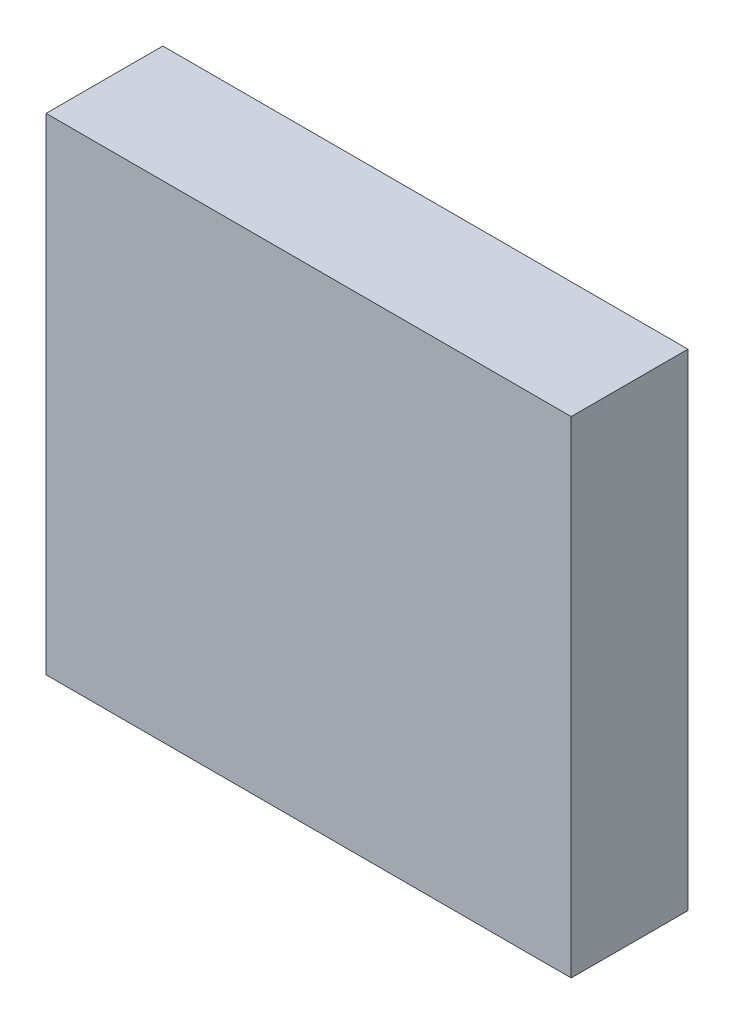
ISO-10303-21;
HEADER;
FILE_DESCRIPTION(('STEP AP214'),'2;1');
FILE_NAME('part.step','',(''),(''),'','','');
FILE_SCHEMA(('AUTOMOTIVE_DESIGN { 1 0 10303 214 1 1 1 1 }'));
ENDSEC;
DATA;
#1=APPLICATION_CONTEXT('core data for automotive mechanical design processes');
#2=APPLICATION_PROTOCOL_DEFINITION('international standard','automotive_design',2000,#1);
#3=PRODUCT_CONTEXT('',#1,'mechanical');
#4=PRODUCT('Part','Part','',(#3));
#5=PRODUCT_RELATED_PRODUCT_CATEGORY('part','',(#4));
#6=PRODUCT_DEFINITION_FORMATION('','',#4);
#7=PRODUCT_DEFINITION_CONTEXT('part definition',#1,'design');
#8=PRODUCT_DEFINITION('design','',#6,#7);
#9=PRODUCT_DEFINITION_SHAPE('','',#8);
#10=(LENGTH_UNIT() NAMED_UNIT(*) SI_UNIT(.MILLI.,.METRE.));
#11=(NAMED_UNIT(*) PLANE_ANGLE_UNIT() SI_UNIT($,.RADIAN.));
#12=(NAMED_UNIT(*) SI_UNIT($,.STERADIAN.) SOLID_ANGLE_UNIT());
#13=UNCERTAINTY_MEASURE_WITH_UNIT(LENGTH_MEASURE(1.E-05),#10,'distance_accuracy_value','');
#14=(GEOMETRIC_REPRESENTATION_CONTEXT(3) GLOBAL_UNCERTAINTY_ASSIGNED_CONTEXT((#13)) GLOBAL_UNIT_ASSIGNED_CONTEXT((#10,
#11,#12)) REPRESENTATION_CONTEXT('',''));
#15=CARTESIAN_POINT('',(0.,0.,0.));
#16=DIRECTION('',(0.,0.,1.));
#17=DIRECTION('',(1.,0.,0.));
#18=AXIS2_PLACEMENT_3D('',#15,#16,#17);
#19=CARTESIAN_POINT('',(5.4,5.,2.4));
#20=DIRECTION('',(-1.,0.,0.));
#21=DIRECTION('',(0.,-1.,0.));
#22=AXIS2_PLACEMENT_3D('',#19,#20,#21);
#23=PLANE('',#22);
#24=DIRECTION('',(0.,1.,0.));
#25=VECTOR('',#24,1.);
#26=CARTESIAN_POINT('',(5.4,5.,0.));
#27=LINE('',#26,#25);
#28=CARTESIAN_POINT('',(5.4,-5.,0.));
#29=VERTEX_POINT('',#28);
#30=CARTESIAN_POINT('',(5.4,5.,0.));
#31=VERTEX_POINT('',#30);
#32=EDGE_CURVE('E294',#29,#31,#27,.T.);
#33=ORIENTED_EDGE('',*,*,#32,.T.);
#34=DIRECTION('',(0.,0.,-1.));
#35=VECTOR('',#34,1.);
#36=CARTESIAN_POINT('',(5.4,5.,2.4));
#37=LINE('',#36,#35);
#38=CARTESIAN_POINT('',(5.4,5.,2.4));
#39=VERTEX_POINT('',#38);
#40=EDGE_CURVE('E11',#39,#31,#37,.T.);
#41=ORIENTED_EDGE('',*,*,#40,.F.);
#42=DIRECTION('',(0.,1.,0.));
#43=VECTOR('',#42,1.);
#44=CARTESIAN_POINT('',(5.4,5.,2.4));
#45=LINE('',#44,#43);
#46=CARTESIAN_POINT('',(5.4,-5.,2.4));
#47=VERTEX_POINT('',#46);
#48=EDGE_CURVE('E301',#47,#39,#45,.T.);
#49=ORIENTED_EDGE('',*,*,#48,.F.);
#50=DIRECTION('',(0.,0.,-1.));
#51=VECTOR('',#50,1.);
#52=CARTESIAN_POINT('',(5.4,-5.,2.4));
#53=LINE('',#52,#51);
#54=EDGE_CURVE('E311',#47,#29,#53,.T.);
#55=ORIENTED_EDGE('',*,*,#54,.T.);
#56=EDGE_LOOP('',(#33,#41,#49,#55));
#57=FACE_BOUND('',#56,.T.);
#58=ADVANCED_FACE('F32',(#57),#23,.F.);
#59=CARTESIAN_POINT('',(-5.4,5.,2.4));
#60=DIRECTION('',(0.,-1.,0.));
#61=DIRECTION('',(0.,0.,-1.));
#62=AXIS2_PLACEMENT_3D('',#59,#60,#61);
#63=PLANE('',#62);
#64=DIRECTION('',(-1.,0.,0.));
#65=VECTOR('',#64,1.);
#66=CARTESIAN_POINT('',(-5.4,5.,0.));
#67=LINE('',#66,#65);
#68=CARTESIAN_POINT('',(-5.4,5.,0.));
#69=VERTEX_POINT('',#68);
#70=EDGE_CURVE('E314',#31,#69,#67,.T.);
#71=ORIENTED_EDGE('',*,*,#70,.T.);
#72=DIRECTION('',(0.,0.,-1.));
#73=VECTOR('',#72,1.);
#74=CARTESIAN_POINT('',(-5.4,5.,2.4));
#75=LINE('',#74,#73);
#76=CARTESIAN_POINT('',(-5.4,5.,2.4));
#77=VERTEX_POINT('',#76);
#78=EDGE_CURVE('E39',#77,#69,#75,.T.);
#79=ORIENTED_EDGE('',*,*,#78,.F.);
#80=DIRECTION('',(-1.,0.,0.));
#81=VECTOR('',#80,1.);
#82=CARTESIAN_POINT('',(-5.4,5.,2.4));
#83=LINE('',#82,#81);
#84=EDGE_CURVE('E304',#39,#77,#83,.T.);
#85=ORIENTED_EDGE('',*,*,#84,.F.);
#86=ORIENTED_EDGE('',*,*,#40,.T.);
#87=EDGE_LOOP('',(#71,#79,#85,#86));
#88=FACE_BOUND('',#87,.T.);
#89=ADVANCED_FACE('F344',(#88),#63,.F.);
#90=CARTESIAN_POINT('',(-5.4,5.,2.4));
#91=DIRECTION('',(1.,0.,0.));
#92=DIRECTION('',(0.,1.,0.));
#93=AXIS2_PLACEMENT_3D('',#90,#91,#92);
#94=PLANE('',#93);
#95=DIRECTION('',(0.,-1.,0.));
#96=VECTOR('',#95,1.);
#97=CARTESIAN_POINT('',(-5.4,5.,0.));
#98=LINE('',#97,#96);
#99=CARTESIAN_POINT('',(-5.4,-5.,0.));
#100=VERTEX_POINT('',#99);
#101=EDGE_CURVE('E316',#69,#100,#98,.T.);
#102=ORIENTED_EDGE('',*,*,#101,.T.);
#103=DIRECTION('',(0.,0.,-1.));
#104=VECTOR('',#103,1.);
#105=CARTESIAN_POINT('',(-5.4,-5.,2.4));
#106=LINE('',#105,#104);
#107=CARTESIAN_POINT('',(-5.4,-5.,2.4));
#108=VERTEX_POINT('',#107);
#109=EDGE_CURVE('E321',#108,#100,#106,.T.);
#110=ORIENTED_EDGE('',*,*,#109,.F.);
#111=DIRECTION('',(0.,-1.,0.));
#112=VECTOR('',#111,1.);
#113=CARTESIAN_POINT('',(-5.4,5.,2.4));
#114=LINE('',#113,#112);
#115=EDGE_CURVE('E307',#77,#108,#114,.T.);
#116=ORIENTED_EDGE('',*,*,#115,.F.);
#117=ORIENTED_EDGE('',*,*,#78,.T.);
#118=EDGE_LOOP('',(#102,#110,#116,#117));
#119=FACE_BOUND('',#118,.T.);
#120=ADVANCED_FACE('F328',(#119),#94,.F.);
#121=CARTESIAN_POINT('',(-5.4,-5.,2.4));
#122=DIRECTION('',(0.,1.,0.));
#123=DIRECTION('',(0.,0.,1.));
#124=AXIS2_PLACEMENT_3D('',#121,#122,#123);
#125=PLANE('',#124);
#126=DIRECTION('',(-1.,0.,0.));
#127=VECTOR('',#126,1.);
#128=CARTESIAN_POINT('',(-4.41,-5.,1.8));
#129=LINE('',#128,#127);
#130=CARTESIAN_POINT('',(-3.21,-5.,1.8));
#131=VERTEX_POINT('',#130);
#132=CARTESIAN_POINT('',(-4.41,-5.,1.8));
#133=VERTEX_POINT('',#132);
#134=EDGE_CURVE('E197',#131,#133,#129,.T.);
#135=ORIENTED_EDGE('',*,*,#134,.F.);
#136=DIRECTION('',(0.,0.,1.));
#137=VECTOR('',#136,1.);
#138=CARTESIAN_POINT('',(-3.21,-5.,1.8));
#139=LINE('',#138,#137);
#140=CARTESIAN_POINT('',(-3.21,-5.,0.6));
#141=VERTEX_POINT('',#140);
#142=EDGE_CURVE('E46',#141,#131,#139,.T.);
#143=ORIENTED_EDGE('',*,*,#142,.F.);
#144=DIRECTION('',(1.,0.,0.));
#145=VECTOR('',#144,1.);
#146=CARTESIAN_POINT('',(-4.41,-5.,0.6));
#147=LINE('',#146,#145);
#148=CARTESIAN_POINT('',(-4.41,-5.,0.6));
#149=VERTEX_POINT('',#148);
#150=EDGE_CURVE('E188',#149,#141,#147,.T.);
#151=ORIENTED_EDGE('',*,*,#150,.F.);
#152=DIRECTION('',(0.,0.,-1.));
#153=VECTOR('',#152,1.);
#154=CARTESIAN_POINT('',(-4.41,-5.,1.8));
#155=LINE('',#154,#153);
#156=EDGE_CURVE('E191',#133,#149,#155,.T.);
#157=ORIENTED_EDGE('',*,*,#156,.F.);
#158=EDGE_LOOP('',(#135,#143,#151,#157));
#159=FACE_BOUND('',#158,.T.);
#160=DIRECTION('',(0.,0.,-1.));
#161=VECTOR('',#160,1.);
#162=CARTESIAN_POINT('',(0.670000000000001,-5.,1.8));
#163=LINE('',#162,#161);
#164=CARTESIAN_POINT('',(0.670000000000001,-5.,1.8));
#165=VERTEX_POINT('',#164);
#166=CARTESIAN_POINT('',(0.670000000000001,-5.,0.6));
#167=VERTEX_POINT('',#166);
#168=EDGE_CURVE('E223',#165,#167,#163,.T.);
#169=ORIENTED_EDGE('',*,*,#168,.F.);
#170=DIRECTION('',(-1.,0.,0.));
#171=VECTOR('',#170,1.);
#172=CARTESIAN_POINT('',(1.87,-5.,1.8));
#173=LINE('',#172,#171);
#174=CARTESIAN_POINT('',(1.87,-5.,1.8));
#175=VERTEX_POINT('',#174);
#176=EDGE_CURVE('E54',#175,#165,#173,.T.);
#177=ORIENTED_EDGE('',*,*,#176,.F.);
#178=DIRECTION('',(0.,0.,1.));
#179=VECTOR('',#178,1.);
#180=CARTESIAN_POINT('',(1.87,-5.,1.8));
#181=LINE('',#180,#179);
#182=CARTESIAN_POINT('',(1.87,-5.,0.6));
#183=VERTEX_POINT('',#182);
#184=EDGE_CURVE('E212',#183,#175,#181,.T.);
#185=ORIENTED_EDGE('',*,*,#184,.F.);
#186=DIRECTION('',(1.,0.,0.));
#187=VECTOR('',#186,1.);
#188=CARTESIAN_POINT('',(1.87,-5.,0.6));
#189=LINE('',#188,#187);
#190=EDGE_CURVE('E227',#167,#183,#189,.T.);
#191=ORIENTED_EDGE('',*,*,#190,.F.);
#192=EDGE_LOOP('',(#169,#177,#185,#191));
#193=FACE_BOUND('',#192,.T.);
#194=DIRECTION('',(0.,0.,-1.));
#195=VECTOR('',#194,1.);
#196=CARTESIAN_POINT('',(3.21,-5.,1.8));
#197=LINE('',#196,#195);
#198=CARTESIAN_POINT('',(3.21,-5.,1.8));
#199=VERTEX_POINT('',#198);
#200=CARTESIAN_POINT('',(3.21,-5.,0.6));
#201=VERTEX_POINT('',#200);
#202=EDGE_CURVE('E254',#199,#201,#197,.T.);
#203=ORIENTED_EDGE('',*,*,#202,.F.);
#204=DIRECTION('',(-1.,0.,0.));
#205=VECTOR('',#204,1.);
#206=CARTESIAN_POINT('',(4.41,-5.,1.8));
#207=LINE('',#206,#205);
#208=CARTESIAN_POINT('',(4.41,-5.,1.8));
#209=VERTEX_POINT('',#208);
#210=EDGE_CURVE('E252',#209,#199,#207,.T.);
#211=ORIENTED_EDGE('',*,*,#210,.F.);
#212=DIRECTION('',(0.,0.,1.));
#213=VECTOR('',#212,1.);
#214=CARTESIAN_POINT('',(4.41,-5.,1.8));
#215=LINE('',#214,#213);
#216=CARTESIAN_POINT('',(4.41,-5.,0.6));
#217=VERTEX_POINT('',#216);
#218=EDGE_CURVE('E242',#217,#209,#215,.T.);
#219=ORIENTED_EDGE('',*,*,#218,.F.);
#220=DIRECTION('',(1.,0.,0.));
#221=VECTOR('',#220,1.);
#222=CARTESIAN_POINT('',(4.41,-5.,0.6));
#223=LINE('',#222,#221);
#224=EDGE_CURVE('E257',#201,#217,#223,.T.);
#225=ORIENTED_EDGE('',*,*,#224,.F.);
#226=EDGE_LOOP('',(#203,#211,#219,#225));
#227=FACE_BOUND('',#226,.T.);
#228=DIRECTION('',(-1.,0.,0.));
#229=VECTOR('',#228,1.);
#230=CARTESIAN_POINT('',(-1.87,-5.,1.8));
#231=LINE('',#230,#229);
#232=CARTESIAN_POINT('',(-0.67,-5.,1.8));
#233=VERTEX_POINT('',#232);
#234=CARTESIAN_POINT('',(-1.87,-5.,1.8));
#235=VERTEX_POINT('',#234);
#236=EDGE_CURVE('E284',#233,#235,#231,.T.);
#237=ORIENTED_EDGE('',*,*,#236,.F.);
#238=DIRECTION('',(0.,0.,1.));
#239=VECTOR('',#238,1.);
#240=CARTESIAN_POINT('',(-0.670000000000001,-5.,1.8));
#241=LINE('',#240,#239);
#242=CARTESIAN_POINT('',(-0.670000000000001,-5.,0.6));
#243=VERTEX_POINT('',#242);
#244=EDGE_CURVE('E204',#243,#233,#241,.T.);
#245=ORIENTED_EDGE('',*,*,#244,.F.);
#246=DIRECTION('',(1.,0.,0.));
#247=VECTOR('',#246,1.);
#248=CARTESIAN_POINT('',(-1.87,-5.,0.6));
#249=LINE('',#248,#247);
#250=CARTESIAN_POINT('',(-1.87,-5.,0.6));
#251=VERTEX_POINT('',#250);
#252=EDGE_CURVE('E273',#251,#243,#249,.T.);
#253=ORIENTED_EDGE('',*,*,#252,.F.);
#254=DIRECTION('',(0.,0.,-1.));
#255=VECTOR('',#254,1.);
#256=CARTESIAN_POINT('',(-1.87,-5.,1.8));
#257=LINE('',#256,#255);
#258=EDGE_CURVE('E287',#235,#251,#257,.T.);
#259=ORIENTED_EDGE('',*,*,#258,.F.);
#260=EDGE_LOOP('',(#237,#245,#253,#259));
#261=FACE_BOUND('',#260,.T.);
#262=DIRECTION('',(1.,0.,0.));
#263=VECTOR('',#262,1.);
#264=CARTESIAN_POINT('',(-5.4,-5.,0.));
#265=LINE('',#264,#263);
#266=EDGE_CURVE('E305',#100,#29,#265,.T.);
#267=ORIENTED_EDGE('',*,*,#266,.T.);
#268=ORIENTED_EDGE('',*,*,#54,.F.);
#269=DIRECTION('',(1.,0.,0.));
#270=VECTOR('',#269,1.);
#271=CARTESIAN_POINT('',(-5.4,-5.,2.4));
#272=LINE('',#271,#270);
#273=EDGE_CURVE('E309',#108,#47,#272,.T.);
#274=ORIENTED_EDGE('',*,*,#273,.F.);
#275=ORIENTED_EDGE('',*,*,#109,.T.);
#276=EDGE_LOOP('',(#267,#268,#274,#275));
#277=FACE_BOUND('',#276,.T.);
#278=ADVANCED_FACE('F337',(#159,#193,#227,#261,#277),#125,.F.);
#279=CARTESIAN_POINT('',(0.,0.,2.4));
#280=DIRECTION('',(0.,0.,1.));
#281=DIRECTION('',(1.,0.,0.));
#282=AXIS2_PLACEMENT_3D('',#279,#280,#281);
#283=PLANE('',#282);
#284=ORIENTED_EDGE('',*,*,#48,.T.);
#285=ORIENTED_EDGE('',*,*,#84,.T.);
#286=ORIENTED_EDGE('',*,*,#115,.T.);
#287=ORIENTED_EDGE('',*,*,#273,.T.);
#288=EDGE_LOOP('',(#284,#285,#286,#287));
#289=FACE_BOUND('',#288,.T.);
#290=ADVANCED_FACE('F343',(#289),#283,.T.);
#291=CARTESIAN_POINT('',(0.,0.,0.));
#292=DIRECTION('',(0.,0.,1.));
#293=DIRECTION('',(1.,0.,0.));
#294=AXIS2_PLACEMENT_3D('',#291,#292,#293);
#295=PLANE('',#294);
#296=ORIENTED_EDGE('',*,*,#32,.F.);
#297=ORIENTED_EDGE('',*,*,#266,.F.);
#298=ORIENTED_EDGE('',*,*,#101,.F.);
#299=ORIENTED_EDGE('',*,*,#70,.F.);
#300=EDGE_LOOP('',(#296,#297,#298,#299));
#301=FACE_BOUND('',#300,.T.);
#302=ADVANCED_FACE('F334',(#301),#295,.F.);
#303=CARTESIAN_POINT('',(-0.670000000000001,-2.2,1.8));
#304=DIRECTION('',(1.,0.,0.));
#305=DIRECTION('',(0.,0.,-1.));
#306=AXIS2_PLACEMENT_3D('',#303,#304,#305);
#307=PLANE('',#306);
#308=ORIENTED_EDGE('',*,*,#244,.T.);
#309=DIRECTION('',(0.,-1.,0.));
#310=VECTOR('',#309,1.);
#311=CARTESIAN_POINT('',(-0.670000000000001,-2.2,1.8));
#312=LINE('',#311,#310);
#313=CARTESIAN_POINT('',(-0.670000000000001,-2.2,1.8));
#314=VERTEX_POINT('',#313);
#315=EDGE_CURVE('E282',#314,#233,#312,.T.);
#316=ORIENTED_EDGE('',*,*,#315,.F.);
#317=DIRECTION('',(0.,0.,1.));
#318=VECTOR('',#317,1.);
#319=CARTESIAN_POINT('',(-0.670000000000001,-2.2,1.8));
#320=LINE('',#319,#318);
#321=CARTESIAN_POINT('',(-0.670000000000001,-2.2,0.6));
#322=VERTEX_POINT('',#321);
#323=EDGE_CURVE('E269',#322,#314,#320,.T.);
#324=ORIENTED_EDGE('',*,*,#323,.F.);
#325=DIRECTION('',(0.,-1.,0.));
#326=VECTOR('',#325,1.);
#327=CARTESIAN_POINT('',(-0.670000000000001,-2.2,0.6));
#328=LINE('',#327,#326);
#329=EDGE_CURVE('E292',#322,#243,#328,.T.);
#330=ORIENTED_EDGE('',*,*,#329,.T.);
#331=EDGE_LOOP('',(#308,#316,#324,#330));
#332=FACE_BOUND('',#331,.T.);
#333=ADVANCED_FACE('F357',(#332),#307,.F.);
#334=CARTESIAN_POINT('',(-1.87,-2.2,0.6));
#335=DIRECTION('',(0.,0.,-1.));
#336=DIRECTION('',(-1.,0.,0.));
#337=AXIS2_PLACEMENT_3D('',#334,#335,#336);
#338=PLANE('',#337);
#339=ORIENTED_EDGE('',*,*,#252,.T.);
#340=ORIENTED_EDGE('',*,*,#329,.F.);
#341=DIRECTION('',(1.,0.,0.));
#342=VECTOR('',#341,1.);
#343=CARTESIAN_POINT('',(-1.87,-2.2,0.6));
#344=LINE('',#343,#342);
#345=CARTESIAN_POINT('',(-1.87,-2.2,0.6));
#346=VERTEX_POINT('',#345);
#347=EDGE_CURVE('E279',#346,#322,#344,.T.);
#348=ORIENTED_EDGE('',*,*,#347,.F.);
#349=DIRECTION('',(0.,-1.,0.));
#350=VECTOR('',#349,1.);
#351=CARTESIAN_POINT('',(-1.87,-2.2,0.6));
#352=LINE('',#351,#350);
#353=EDGE_CURVE('E295',#346,#251,#352,.T.);
#354=ORIENTED_EDGE('',*,*,#353,.T.);
#355=EDGE_LOOP('',(#339,#340,#348,#354));
#356=FACE_BOUND('',#355,.T.);
#357=ADVANCED_FACE('F362',(#356),#338,.F.);
#358=CARTESIAN_POINT('',(-1.87,-2.2,1.8));
#359=DIRECTION('',(-1.,0.,0.));
#360=DIRECTION('',(0.,0.,1.));
#361=AXIS2_PLACEMENT_3D('',#358,#359,#360);
#362=PLANE('',#361);
#363=ORIENTED_EDGE('',*,*,#258,.T.);
#364=ORIENTED_EDGE('',*,*,#353,.F.);
#365=DIRECTION('',(0.,0.,-1.));
#366=VECTOR('',#365,1.);
#367=CARTESIAN_POINT('',(-1.87,-2.2,1.8));
#368=LINE('',#367,#366);
#369=CARTESIAN_POINT('',(-1.87,-2.2,1.8));
#370=VERTEX_POINT('',#369);
#371=EDGE_CURVE('E276',#370,#346,#368,.T.);
#372=ORIENTED_EDGE('',*,*,#371,.F.);
#373=DIRECTION('',(0.,-1.,0.));
#374=VECTOR('',#373,1.);
#375=CARTESIAN_POINT('',(-1.87,-2.2,1.8));
#376=LINE('',#375,#374);
#377=EDGE_CURVE('E297',#370,#235,#376,.T.);
#378=ORIENTED_EDGE('',*,*,#377,.T.);
#379=EDGE_LOOP('',(#363,#364,#372,#378));
#380=FACE_BOUND('',#379,.T.);
#381=ADVANCED_FACE('F368',(#380),#362,.F.);
#382=CARTESIAN_POINT('',(-1.87,-2.2,1.8));
#383=DIRECTION('',(0.,0.,1.));
#384=DIRECTION('',(1.,0.,0.));
#385=AXIS2_PLACEMENT_3D('',#382,#383,#384);
#386=PLANE('',#385);
#387=ORIENTED_EDGE('',*,*,#236,.T.);
#388=ORIENTED_EDGE('',*,*,#377,.F.);
#389=DIRECTION('',(-1.,0.,0.));
#390=VECTOR('',#389,1.);
#391=CARTESIAN_POINT('',(-1.87,-2.2,1.8));
#392=LINE('',#391,#390);
#393=EDGE_CURVE('E272',#314,#370,#392,.T.);
#394=ORIENTED_EDGE('',*,*,#393,.F.);
#395=ORIENTED_EDGE('',*,*,#315,.T.);
#396=EDGE_LOOP('',(#387,#388,#394,#395));
#397=FACE_BOUND('',#396,.T.);
#398=ADVANCED_FACE('F364',(#397),#386,.F.);
#399=CARTESIAN_POINT('',(0.,-2.2,0.));
#400=DIRECTION('',(0.,-1.,0.));
#401=DIRECTION('',(0.,0.,-1.));
#402=AXIS2_PLACEMENT_3D('',#399,#400,#401);
#403=PLANE('',#402);
#404=ORIENTED_EDGE('',*,*,#323,.T.);
#405=ORIENTED_EDGE('',*,*,#393,.T.);
#406=ORIENTED_EDGE('',*,*,#371,.T.);
#407=ORIENTED_EDGE('',*,*,#347,.T.);
#408=EDGE_LOOP('',(#404,#405,#406,#407));
#409=FACE_BOUND('',#408,.T.);
#410=ADVANCED_FACE('F367',(#409),#403,.T.);
#411=CARTESIAN_POINT('',(4.41,-2.2,1.8));
#412=DIRECTION('',(0.,0.,1.));
#413=DIRECTION('',(1.,0.,0.));
#414=AXIS2_PLACEMENT_3D('',#411,#412,#413);
#415=PLANE('',#414);
#416=ORIENTED_EDGE('',*,*,#210,.T.);
#417=DIRECTION('',(0.,-1.,0.));
#418=VECTOR('',#417,1.);
#419=CARTESIAN_POINT('',(3.21,-2.2,1.8));
#420=LINE('',#419,#418);
#421=CARTESIAN_POINT('',(3.21,-2.2,1.8));
#422=VERTEX_POINT('',#421);
#423=EDGE_CURVE('E251',#422,#199,#420,.T.);
#424=ORIENTED_EDGE('',*,*,#423,.F.);
#425=DIRECTION('',(-1.,0.,0.));
#426=VECTOR('',#425,1.);
#427=CARTESIAN_POINT('',(4.41,-2.2,1.8));
#428=LINE('',#427,#426);
#429=CARTESIAN_POINT('',(4.41,-2.2,1.8));
#430=VERTEX_POINT('',#429);
#431=EDGE_CURVE('E238',#430,#422,#428,.T.);
#432=ORIENTED_EDGE('',*,*,#431,.F.);
#433=DIRECTION('',(0.,-1.,0.));
#434=VECTOR('',#433,1.);
#435=CARTESIAN_POINT('',(4.41,-2.2,1.8));
#436=LINE('',#435,#434);
#437=EDGE_CURVE('E224',#430,#209,#436,.T.);
#438=ORIENTED_EDGE('',*,*,#437,.T.);
#439=EDGE_LOOP('',(#416,#424,#432,#438));
#440=FACE_BOUND('',#439,.T.);
#441=ADVANCED_FACE('F378',(#440),#415,.F.);
#442=CARTESIAN_POINT('',(4.41,-2.2,1.8));
#443=DIRECTION('',(1.,0.,0.));
#444=DIRECTION('',(0.,0.,-1.));
#445=AXIS2_PLACEMENT_3D('',#442,#443,#444);
#446=PLANE('',#445);
#447=ORIENTED_EDGE('',*,*,#218,.T.);
#448=ORIENTED_EDGE('',*,*,#437,.F.);
#449=DIRECTION('',(0.,0.,1.));
#450=VECTOR('',#449,1.);
#451=CARTESIAN_POINT('',(4.41,-2.2,1.8));
#452=LINE('',#451,#450);
#453=CARTESIAN_POINT('',(4.41,-2.2,0.6));
#454=VERTEX_POINT('',#453);
#455=EDGE_CURVE('E248',#454,#430,#452,.T.);
#456=ORIENTED_EDGE('',*,*,#455,.F.);
#457=DIRECTION('',(0.,-1.,0.));
#458=VECTOR('',#457,1.);
#459=CARTESIAN_POINT('',(4.41,-2.2,0.6));
#460=LINE('',#459,#458);
#461=EDGE_CURVE('E263',#454,#217,#460,.T.);
#462=ORIENTED_EDGE('',*,*,#461,.T.);
#463=EDGE_LOOP('',(#447,#448,#456,#462));
#464=FACE_BOUND('',#463,.T.);
#465=ADVANCED_FACE('F382',(#464),#446,.F.);
#466=CARTESIAN_POINT('',(4.41,-2.2,0.6));
#467=DIRECTION('',(0.,0.,-1.));
#468=DIRECTION('',(-1.,0.,0.));
#469=AXIS2_PLACEMENT_3D('',#466,#467,#468);
#470=PLANE('',#469);
#471=ORIENTED_EDGE('',*,*,#224,.T.);
#472=ORIENTED_EDGE('',*,*,#461,.F.);
#473=DIRECTION('',(1.,0.,0.));
#474=VECTOR('',#473,1.);
#475=CARTESIAN_POINT('',(4.41,-2.2,0.6));
#476=LINE('',#475,#474);
#477=CARTESIAN_POINT('',(3.21,-2.2,0.6));
#478=VERTEX_POINT('',#477);
#479=EDGE_CURVE('E245',#478,#454,#476,.T.);
#480=ORIENTED_EDGE('',*,*,#479,.F.);
#481=DIRECTION('',(0.,-1.,0.));
#482=VECTOR('',#481,1.);
#483=CARTESIAN_POINT('',(3.21,-2.2,0.6));
#484=LINE('',#483,#482);
#485=EDGE_CURVE('E265',#478,#201,#484,.T.);
#486=ORIENTED_EDGE('',*,*,#485,.T.);
#487=EDGE_LOOP('',(#471,#472,#480,#486));
#488=FACE_BOUND('',#487,.T.);
#489=ADVANCED_FACE('F388',(#488),#470,.F.);
#490=CARTESIAN_POINT('',(3.21,-2.2,1.8));
#491=DIRECTION('',(-1.,0.,0.));
#492=DIRECTION('',(0.,0.,1.));
#493=AXIS2_PLACEMENT_3D('',#490,#491,#492);
#494=PLANE('',#493);
#495=ORIENTED_EDGE('',*,*,#202,.T.);
#496=ORIENTED_EDGE('',*,*,#485,.F.);
#497=DIRECTION('',(0.,0.,-1.));
#498=VECTOR('',#497,1.);
#499=CARTESIAN_POINT('',(3.21,-2.2,1.8));
#500=LINE('',#499,#498);
#501=EDGE_CURVE('E241',#422,#478,#500,.T.);
#502=ORIENTED_EDGE('',*,*,#501,.F.);
#503=ORIENTED_EDGE('',*,*,#423,.T.);
#504=EDGE_LOOP('',(#495,#496,#502,#503));
#505=FACE_BOUND('',#504,.T.);
#506=ADVANCED_FACE('F384',(#505),#494,.F.);
#507=CARTESIAN_POINT('',(0.,-2.2,0.));
#508=DIRECTION('',(0.,-1.,0.));
#509=DIRECTION('',(0.,0.,-1.));
#510=AXIS2_PLACEMENT_3D('',#507,#508,#509);
#511=PLANE('',#510);
#512=ORIENTED_EDGE('',*,*,#431,.T.);
#513=ORIENTED_EDGE('',*,*,#501,.T.);
#514=ORIENTED_EDGE('',*,*,#479,.T.);
#515=ORIENTED_EDGE('',*,*,#455,.T.);
#516=EDGE_LOOP('',(#512,#513,#514,#515));
#517=FACE_BOUND('',#516,.T.);
#518=ADVANCED_FACE('F387',(#517),#511,.T.);
#519=CARTESIAN_POINT('',(1.87,-2.2,1.8));
#520=DIRECTION('',(0.,0.,1.));
#521=DIRECTION('',(1.,0.,0.));
#522=AXIS2_PLACEMENT_3D('',#519,#520,#521);
#523=PLANE('',#522);
#524=ORIENTED_EDGE('',*,*,#176,.T.);
#525=DIRECTION('',(0.,-1.,0.));
#526=VECTOR('',#525,1.);
#527=CARTESIAN_POINT('',(0.670000000000001,-2.2,1.8));
#528=LINE('',#527,#526);
#529=CARTESIAN_POINT('',(0.670000000000001,-2.2,1.8));
#530=VERTEX_POINT('',#529);
#531=EDGE_CURVE('E221',#530,#165,#528,.T.);
#532=ORIENTED_EDGE('',*,*,#531,.F.);
#533=DIRECTION('',(-1.,0.,0.));
#534=VECTOR('',#533,1.);
#535=CARTESIAN_POINT('',(1.87,-2.2,1.8));
#536=LINE('',#535,#534);
#537=CARTESIAN_POINT('',(1.87,-2.2,1.8));
#538=VERTEX_POINT('',#537);
#539=EDGE_CURVE('E208',#538,#530,#536,.T.);
#540=ORIENTED_EDGE('',*,*,#539,.F.);
#541=DIRECTION('',(0.,-1.,0.));
#542=VECTOR('',#541,1.);
#543=CARTESIAN_POINT('',(1.87,-2.2,1.8));
#544=LINE('',#543,#542);
#545=EDGE_CURVE('E198',#538,#175,#544,.T.);
#546=ORIENTED_EDGE('',*,*,#545,.T.);
#547=EDGE_LOOP('',(#524,#532,#540,#546));
#548=FACE_BOUND('',#547,.T.);
#549=ADVANCED_FACE('F398',(#548),#523,.F.);
#550=CARTESIAN_POINT('',(1.87,-2.2,1.8));
#551=DIRECTION('',(1.,0.,0.));
#552=DIRECTION('',(0.,0.,-1.));
#553=AXIS2_PLACEMENT_3D('',#550,#551,#552);
#554=PLANE('',#553);
#555=ORIENTED_EDGE('',*,*,#184,.T.);
#556=ORIENTED_EDGE('',*,*,#545,.F.);
#557=DIRECTION('',(0.,0.,1.));
#558=VECTOR('',#557,1.);
#559=CARTESIAN_POINT('',(1.87,-2.2,1.8));
#560=LINE('',#559,#558);
#561=CARTESIAN_POINT('',(1.87,-2.2,0.6));
#562=VERTEX_POINT('',#561);
#563=EDGE_CURVE('E218',#562,#538,#560,.T.);
#564=ORIENTED_EDGE('',*,*,#563,.F.);
#565=DIRECTION('',(0.,-1.,0.));
#566=VECTOR('',#565,1.);
#567=CARTESIAN_POINT('',(1.87,-2.2,0.6));
#568=LINE('',#567,#566);
#569=EDGE_CURVE('E233',#562,#183,#568,.T.);
#570=ORIENTED_EDGE('',*,*,#569,.T.);
#571=EDGE_LOOP('',(#555,#556,#564,#570));
#572=FACE_BOUND('',#571,.T.);
#573=ADVANCED_FACE('F402',(#572),#554,.F.);
#574=CARTESIAN_POINT('',(1.87,-2.2,0.6));
#575=DIRECTION('',(0.,0.,-1.));
#576=DIRECTION('',(-1.,0.,0.));
#577=AXIS2_PLACEMENT_3D('',#574,#575,#576);
#578=PLANE('',#577);
#579=ORIENTED_EDGE('',*,*,#190,.T.);
#580=ORIENTED_EDGE('',*,*,#569,.F.);
#581=DIRECTION('',(1.,0.,0.));
#582=VECTOR('',#581,1.);
#583=CARTESIAN_POINT('',(1.87,-2.2,0.6));
#584=LINE('',#583,#582);
#585=CARTESIAN_POINT('',(0.670000000000001,-2.2,0.6));
#586=VERTEX_POINT('',#585);
#587=EDGE_CURVE('E215',#586,#562,#584,.T.);
#588=ORIENTED_EDGE('',*,*,#587,.F.);
#589=DIRECTION('',(0.,-1.,0.));
#590=VECTOR('',#589,1.);
#591=CARTESIAN_POINT('',(0.670000000000001,-2.2,0.6));
#592=LINE('',#591,#590);
#593=EDGE_CURVE('E235',#586,#167,#592,.T.);
#594=ORIENTED_EDGE('',*,*,#593,.T.);
#595=EDGE_LOOP('',(#579,#580,#588,#594));
#596=FACE_BOUND('',#595,.T.);
#597=ADVANCED_FACE('F407',(#596),#578,.F.);
#598=CARTESIAN_POINT('',(0.670000000000001,-2.2,1.8));
#599=DIRECTION('',(-1.,0.,0.));
#600=DIRECTION('',(0.,0.,1.));
#601=AXIS2_PLACEMENT_3D('',#598,#599,#600);
#602=PLANE('',#601);
#603=ORIENTED_EDGE('',*,*,#168,.T.);
#604=ORIENTED_EDGE('',*,*,#593,.F.);
#605=DIRECTION('',(0.,0.,-1.));
#606=VECTOR('',#605,1.);
#607=CARTESIAN_POINT('',(0.670000000000001,-2.2,1.8));
#608=LINE('',#607,#606);
#609=EDGE_CURVE('E211',#530,#586,#608,.T.);
#610=ORIENTED_EDGE('',*,*,#609,.F.);
#611=ORIENTED_EDGE('',*,*,#531,.T.);
#612=EDGE_LOOP('',(#603,#604,#610,#611));
#613=FACE_BOUND('',#612,.T.);
#614=ADVANCED_FACE('F403',(#613),#602,.F.);
#615=CARTESIAN_POINT('',(0.,-2.2,0.));
#616=DIRECTION('',(0.,-1.,0.));
#617=DIRECTION('',(0.,0.,-1.));
#618=AXIS2_PLACEMENT_3D('',#615,#616,#617);
#619=PLANE('',#618);
#620=ORIENTED_EDGE('',*,*,#539,.T.);
#621=ORIENTED_EDGE('',*,*,#609,.T.);
#622=ORIENTED_EDGE('',*,*,#587,.T.);
#623=ORIENTED_EDGE('',*,*,#563,.T.);
#624=EDGE_LOOP('',(#620,#621,#622,#623));
#625=FACE_BOUND('',#624,.T.);
#626=ADVANCED_FACE('F406',(#625),#619,.T.);
#627=CARTESIAN_POINT('',(-3.21,-2.2,1.8));
#628=DIRECTION('',(1.,0.,0.));
#629=DIRECTION('',(0.,0.,-1.));
#630=AXIS2_PLACEMENT_3D('',#627,#628,#629);
#631=PLANE('',#630);
#632=ORIENTED_EDGE('',*,*,#142,.T.);
#633=DIRECTION('',(0.,-1.,0.));
#634=VECTOR('',#633,1.);
#635=CARTESIAN_POINT('',(-3.21,-2.2,1.8));
#636=LINE('',#635,#634);
#637=CARTESIAN_POINT('',(-3.21,-2.2,1.8));
#638=VERTEX_POINT('',#637);
#639=EDGE_CURVE('E166',#638,#131,#636,.T.);
#640=ORIENTED_EDGE('',*,*,#639,.F.);
#641=DIRECTION('',(0.,0.,1.));
#642=VECTOR('',#641,1.);
#643=CARTESIAN_POINT('',(-3.21,-2.2,1.8));
#644=LINE('',#643,#642);
#645=CARTESIAN_POINT('',(-3.21,-2.2,0.6));
#646=VERTEX_POINT('',#645);
#647=EDGE_CURVE('E170',#646,#638,#644,.T.);
#648=ORIENTED_EDGE('',*,*,#647,.F.);
#649=DIRECTION('',(0.,-1.,0.));
#650=VECTOR('',#649,1.);
#651=CARTESIAN_POINT('',(-3.21,-2.2,0.6));
#652=LINE('',#651,#650);
#653=EDGE_CURVE('E202',#646,#141,#652,.T.);
#654=ORIENTED_EDGE('',*,*,#653,.T.);
#655=EDGE_LOOP('',(#632,#640,#648,#654));
#656=FACE_BOUND('',#655,.T.);
#657=ADVANCED_FACE('F168',(#656),#631,.F.);
#658=CARTESIAN_POINT('',(-4.41,-2.2,0.6));
#659=DIRECTION('',(0.,0.,-1.));
#660=DIRECTION('',(-1.,0.,0.));
#661=AXIS2_PLACEMENT_3D('',#658,#659,#660);
#662=PLANE('',#661);
#663=ORIENTED_EDGE('',*,*,#150,.T.);
#664=ORIENTED_EDGE('',*,*,#653,.F.);
#665=DIRECTION('',(1.,0.,0.));
#666=VECTOR('',#665,1.);
#667=CARTESIAN_POINT('',(-4.41,-2.2,0.6));
#668=LINE('',#667,#666);
#669=CARTESIAN_POINT('',(-4.41,-2.2,0.6));
#670=VERTEX_POINT('',#669);
#671=EDGE_CURVE('E176',#670,#646,#668,.T.);
#672=ORIENTED_EDGE('',*,*,#671,.F.);
#673=DIRECTION('',(0.,-1.,0.));
#674=VECTOR('',#673,1.);
#675=CARTESIAN_POINT('',(-4.41,-2.2,0.6));
#676=LINE('',#675,#674);
#677=EDGE_CURVE('E205',#670,#149,#676,.T.);
#678=ORIENTED_EDGE('',*,*,#677,.T.);
#679=EDGE_LOOP('',(#663,#664,#672,#678));
#680=FACE_BOUND('',#679,.T.);
#681=ADVANCED_FACE('F420',(#680),#662,.F.);
#682=CARTESIAN_POINT('',(-4.41,-2.2,1.8));
#683=DIRECTION('',(-1.,0.,0.));
#684=DIRECTION('',(0.,0.,1.));
#685=AXIS2_PLACEMENT_3D('',#682,#683,#684);
#686=PLANE('',#685);
#687=ORIENTED_EDGE('',*,*,#156,.T.);
#688=ORIENTED_EDGE('',*,*,#677,.F.);
#689=DIRECTION('',(0.,0.,-1.));
#690=VECTOR('',#689,1.);
#691=CARTESIAN_POINT('',(-4.41,-2.2,1.8));
#692=LINE('',#691,#690);
#693=CARTESIAN_POINT('',(-4.41,-2.2,1.8));
#694=VERTEX_POINT('',#693);
#695=EDGE_CURVE('E184',#694,#670,#692,.T.);
#696=ORIENTED_EDGE('',*,*,#695,.F.);
#697=DIRECTION('',(0.,-1.,0.));
#698=VECTOR('',#697,1.);
#699=CARTESIAN_POINT('',(-4.41,-2.2,1.8));
#700=LINE('',#699,#698);
#701=EDGE_CURVE('E175',#694,#133,#700,.T.);
#702=ORIENTED_EDGE('',*,*,#701,.T.);
#703=EDGE_LOOP('',(#687,#688,#696,#702));
#704=FACE_BOUND('',#703,.T.);
#705=ADVANCED_FACE('F423',(#704),#686,.F.);
#706=CARTESIAN_POINT('',(-4.41,-2.2,1.8));
#707=DIRECTION('',(0.,0.,1.));
#708=DIRECTION('',(1.,0.,0.));
#709=AXIS2_PLACEMENT_3D('',#706,#707,#708);
#710=PLANE('',#709);
#711=ORIENTED_EDGE('',*,*,#134,.T.);
#712=ORIENTED_EDGE('',*,*,#701,.F.);
#713=DIRECTION('',(-1.,0.,0.));
#714=VECTOR('',#713,1.);
#715=CARTESIAN_POINT('',(-4.41,-2.2,1.8));
#716=LINE('',#715,#714);
#717=EDGE_CURVE('E179',#638,#694,#716,.T.);
#718=ORIENTED_EDGE('',*,*,#717,.F.);
#719=ORIENTED_EDGE('',*,*,#639,.T.);
#720=EDGE_LOOP('',(#711,#712,#718,#719));
#721=FACE_BOUND('',#720,.T.);
#722=ADVANCED_FACE('F180',(#721),#710,.F.);
#723=CARTESIAN_POINT('',(0.,-2.2,0.));
#724=DIRECTION('',(0.,-1.,0.));
#725=DIRECTION('',(0.,0.,-1.));
#726=AXIS2_PLACEMENT_3D('',#723,#724,#725);
#727=PLANE('',#726);
#728=ORIENTED_EDGE('',*,*,#647,.T.);
#729=ORIENTED_EDGE('',*,*,#717,.T.);
#730=ORIENTED_EDGE('',*,*,#695,.T.);
#731=ORIENTED_EDGE('',*,*,#671,.T.);
#732=EDGE_LOOP('',(#728,#729,#730,#731));
#733=FACE_BOUND('',#732,.T.);
#734=ADVANCED_FACE('F186',(#733),#727,.T.);
#735=CLOSED_SHELL('',(#58,#89,#120,#278,#290,#302,#333,#357,#381,#398,#410,#441,#465,#489,#506,
#518,#549,#573,#597,#614,#626,#657,#681,#705,#722,#734));
#736=MANIFOLD_SOLID_BREP('B2',#735);
#737=ADVANCED_BREP_SHAPE_REPRESENTATION('',(#18,#736),#14);
#738=SHAPE_DEFINITION_REPRESENTATION(#9,#737);
ENDSEC;
END-ISO-10303-21;
